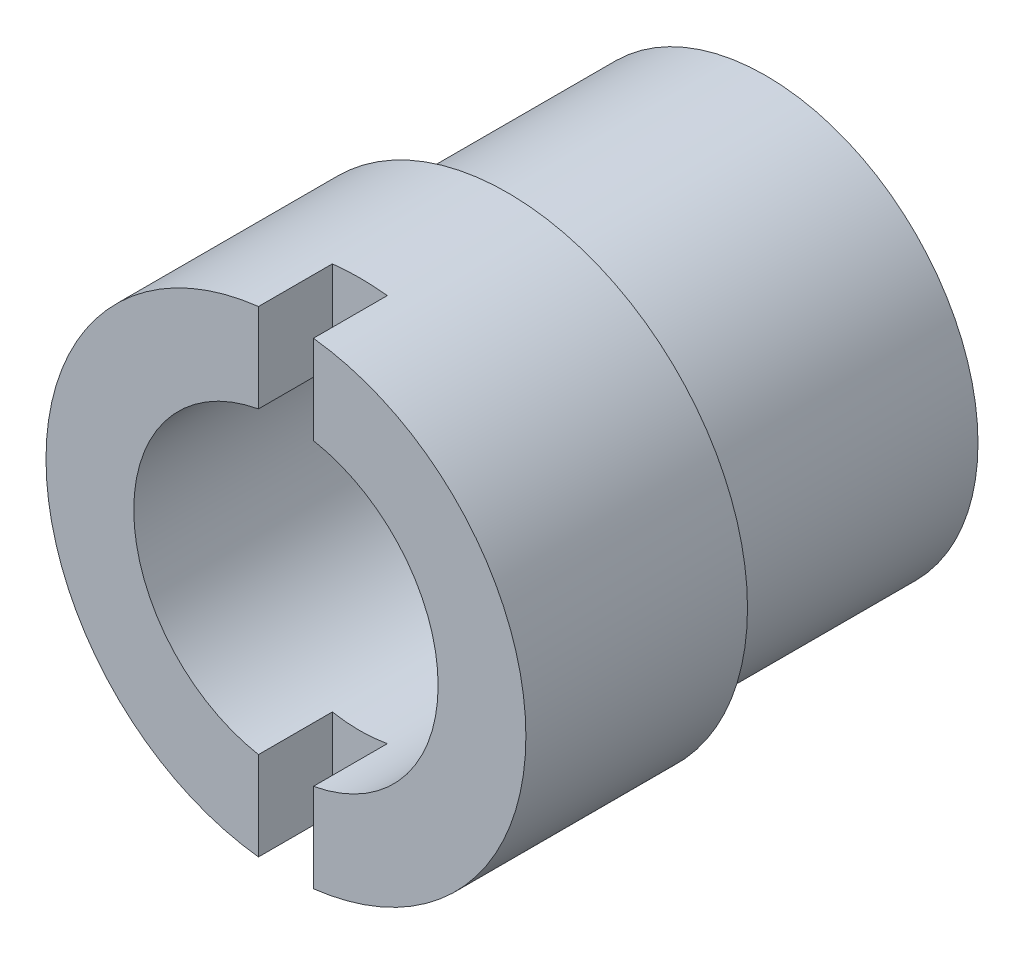
ISO-10303-21;
HEADER;
FILE_DESCRIPTION(('STEP AP214'),'2;1');
FILE_NAME('part.step','',(''),(''),'','','');
FILE_SCHEMA(('AUTOMOTIVE_DESIGN { 1 0 10303 214 1 1 1 1 }'));
ENDSEC;
DATA;
#1=APPLICATION_CONTEXT('core data for automotive mechanical design processes');
#2=APPLICATION_PROTOCOL_DEFINITION('international standard','automotive_design',2000,#1);
#3=PRODUCT_CONTEXT('',#1,'mechanical');
#4=PRODUCT('Part','Part','',(#3));
#5=PRODUCT_RELATED_PRODUCT_CATEGORY('part','',(#4));
#6=PRODUCT_DEFINITION_FORMATION('','',#4);
#7=PRODUCT_DEFINITION_CONTEXT('part definition',#1,'design');
#8=PRODUCT_DEFINITION('design','',#6,#7);
#9=PRODUCT_DEFINITION_SHAPE('','',#8);
#10=(LENGTH_UNIT() NAMED_UNIT(*) SI_UNIT(.MILLI.,.METRE.));
#11=(NAMED_UNIT(*) PLANE_ANGLE_UNIT() SI_UNIT($,.RADIAN.));
#12=(NAMED_UNIT(*) SI_UNIT($,.STERADIAN.) SOLID_ANGLE_UNIT());
#13=UNCERTAINTY_MEASURE_WITH_UNIT(LENGTH_MEASURE(1.E-05),#10,'distance_accuracy_value','');
#14=(GEOMETRIC_REPRESENTATION_CONTEXT(3) GLOBAL_UNCERTAINTY_ASSIGNED_CONTEXT((#13)) GLOBAL_UNIT_ASSIGNED_CONTEXT((#10,
#11,#12)) REPRESENTATION_CONTEXT('',''));
#15=CARTESIAN_POINT('',(0.,0.,0.));
#16=DIRECTION('',(0.,0.,1.));
#17=DIRECTION('',(1.,0.,0.));
#18=AXIS2_PLACEMENT_3D('',#15,#16,#17);
#19=CARTESIAN_POINT('',(0.,0.,0.));
#20=DIRECTION('',(0.,0.,1.));
#21=DIRECTION('',(1.,0.,0.));
#22=AXIS2_PLACEMENT_3D('',#19,#20,#21);
#23=PLANE('',#22);
#24=DIRECTION('',(0.,1.,0.));
#25=VECTOR('',#24,1.);
#26=CARTESIAN_POINT('',(-1.1811,-10.3124,0.));
#27=LINE('',#26,#25);
#28=CARTESIAN_POINT('',(-1.1811,6.43297311046766,0.));
#29=VERTEX_POINT('',#28);
#30=CARTESIAN_POINT('',(-1.1811,10.2445398408128,0.));
#31=VERTEX_POINT('',#30);
#32=EDGE_CURVE('E173',#29,#31,#27,.T.);
#33=ORIENTED_EDGE('',*,*,#32,.T.);
#34=CARTESIAN_POINT('',(0.,0.,0.));
#35=DIRECTION('',(0.,0.,1.));
#36=DIRECTION('',(1.,0.,0.));
#37=AXIS2_PLACEMENT_3D('',#34,#35,#36);
#38=CIRCLE('',#37,10.3124);
#39=CARTESIAN_POINT('',(-1.1811,-10.2445398408128,0.));
#40=VERTEX_POINT('',#39);
#41=EDGE_CURVE('E136',#31,#40,#38,.T.);
#42=ORIENTED_EDGE('',*,*,#41,.T.);
#43=CARTESIAN_POINT('',(-1.1811,-6.43297311046766,0.));
#44=VERTEX_POINT('',#43);
#45=EDGE_CURVE('E172',#40,#44,#27,.T.);
#46=ORIENTED_EDGE('',*,*,#45,.T.);
#47=CARTESIAN_POINT('',(0.,0.,0.));
#48=DIRECTION('',(0.,0.,1.));
#49=DIRECTION('',(1.,0.,0.));
#50=AXIS2_PLACEMENT_3D('',#47,#48,#49);
#51=CIRCLE('',#50,6.5405);
#52=EDGE_CURVE('E137',#29,#44,#51,.T.);
#53=ORIENTED_EDGE('',*,*,#52,.F.);
#54=EDGE_LOOP('',(#33,#42,#46,#53));
#55=FACE_BOUND('',#54,.T.);
#56=ADVANCED_FACE('F48',(#55),#23,.T.);
#57=CARTESIAN_POINT('',(0.,0.,-9.525));
#58=DIRECTION('',(0.,0.,1.));
#59=DIRECTION('',(1.,0.,0.));
#60=AXIS2_PLACEMENT_3D('',#57,#58,#59);
#61=CYLINDRICAL_SURFACE('',#60,10.3124);
#62=DIRECTION('',(0.,0.,1.));
#63=VECTOR('',#62,1.);
#64=CARTESIAN_POINT('',(-1.1811,-10.2445398408128,-9.525));
#65=LINE('',#64,#63);
#66=CARTESIAN_POINT('',(-1.1811,-10.2445398408128,-3.175));
#67=VERTEX_POINT('',#66);
#68=EDGE_CURVE('E181',#40,#67,#65,.F.);
#69=ORIENTED_EDGE('',*,*,#68,.F.);
#70=ORIENTED_EDGE('',*,*,#41,.F.);
#71=DIRECTION('',(0.,0.,1.));
#72=VECTOR('',#71,1.);
#73=CARTESIAN_POINT('',(-1.1811,10.2445398408128,-9.525));
#74=LINE('',#73,#72);
#75=CARTESIAN_POINT('',(-1.1811,10.2445398408128,-3.175));
#76=VERTEX_POINT('',#75);
#77=EDGE_CURVE('E179',#76,#31,#74,.T.);
#78=ORIENTED_EDGE('',*,*,#77,.F.);
#79=CARTESIAN_POINT('',(0.,0.,-3.175));
#80=DIRECTION('',(0.,0.,-1.));
#81=DIRECTION('',(-1.,0.,0.));
#82=AXIS2_PLACEMENT_3D('',#79,#80,#81);
#83=CIRCLE('',#82,10.3124);
#84=CARTESIAN_POINT('',(1.1811,10.2445398408128,-3.175));
#85=VERTEX_POINT('',#84);
#86=EDGE_CURVE('E165',#85,#76,#83,.F.);
#87=ORIENTED_EDGE('',*,*,#86,.F.);
#88=DIRECTION('',(0.,0.,1.));
#89=VECTOR('',#88,1.);
#90=CARTESIAN_POINT('',(1.1811,10.2445398408128,-9.525));
#91=LINE('',#90,#89);
#92=CARTESIAN_POINT('',(1.1811,10.2445398408128,0.));
#93=VERTEX_POINT('',#92);
#94=EDGE_CURVE('E119',#93,#85,#91,.F.);
#95=ORIENTED_EDGE('',*,*,#94,.F.);
#96=CARTESIAN_POINT('',(1.1811,-10.2445398408128,0.));
#97=VERTEX_POINT('',#96);
#98=EDGE_CURVE('E127',#97,#93,#38,.T.);
#99=ORIENTED_EDGE('',*,*,#98,.F.);
#100=DIRECTION('',(0.,0.,1.));
#101=VECTOR('',#100,1.);
#102=CARTESIAN_POINT('',(1.1811,-10.2445398408128,-9.525));
#103=LINE('',#102,#101);
#104=CARTESIAN_POINT('',(1.1811,-10.2445398408128,-3.175));
#105=VERTEX_POINT('',#104);
#106=EDGE_CURVE('E112',#105,#97,#103,.T.);
#107=ORIENTED_EDGE('',*,*,#106,.F.);
#108=EDGE_CURVE('E177',#67,#105,#83,.F.);
#109=ORIENTED_EDGE('',*,*,#108,.F.);
#110=EDGE_LOOP('',(#69,#70,#78,#87,#95,#99,#107,#109));
#111=FACE_BOUND('',#110,.T.);
#112=CARTESIAN_POINT('',(0.,0.,-9.525));
#113=DIRECTION('',(0.,0.,1.));
#114=DIRECTION('',(1.,0.,0.));
#115=AXIS2_PLACEMENT_3D('',#112,#113,#114);
#116=CIRCLE('',#115,10.3124);
#117=CARTESIAN_POINT('',(10.3124,0.,-9.525));
#118=VERTEX_POINT('',#117);
#119=EDGE_CURVE('E140',#118,#118,#116,.T.);
#120=ORIENTED_EDGE('',*,*,#119,.T.);
#121=EDGE_LOOP('',(#120));
#122=FACE_BOUND('',#121,.T.);
#123=ADVANCED_FACE('F50',(#111,#122),#61,.T.);
#124=CARTESIAN_POINT('',(0.,0.,-9.525));
#125=DIRECTION('',(0.,0.,1.));
#126=DIRECTION('',(1.,0.,0.));
#127=AXIS2_PLACEMENT_3D('',#124,#125,#126);
#128=PLANE('',#127);
#129=CARTESIAN_POINT('',(0.,0.,-9.525));
#130=DIRECTION('',(0.,0.,-1.));
#131=DIRECTION('',(-1.,0.,0.));
#132=AXIS2_PLACEMENT_3D('',#129,#130,#131);
#133=CIRCLE('',#132,9.1186);
#134=CARTESIAN_POINT('',(-9.1186,0.,-9.525));
#135=VERTEX_POINT('',#134);
#136=EDGE_CURVE('E148',#135,#135,#133,.T.);
#137=ORIENTED_EDGE('',*,*,#136,.F.);
#138=EDGE_LOOP('',(#137));
#139=FACE_BOUND('',#138,.T.);
#140=ORIENTED_EDGE('',*,*,#119,.F.);
#141=EDGE_LOOP('',(#140));
#142=FACE_BOUND('',#141,.T.);
#143=ADVANCED_FACE('F215',(#139,#142),#128,.F.);
#144=DIRECTION('',(0.,1.,0.));
#145=VECTOR('',#144,1.);
#146=CARTESIAN_POINT('',(1.1811,-10.3124,0.));
#147=LINE('',#146,#145);
#148=CARTESIAN_POINT('',(1.1811,-6.43297311046766,0.));
#149=VERTEX_POINT('',#148);
#150=EDGE_CURVE('E71',#97,#149,#147,.T.);
#151=ORIENTED_EDGE('',*,*,#150,.F.);
#152=ORIENTED_EDGE('',*,*,#98,.T.);
#153=CARTESIAN_POINT('',(1.1811,6.43297311046766,0.));
#154=VERTEX_POINT('',#153);
#155=EDGE_CURVE('E130',#154,#93,#147,.T.);
#156=ORIENTED_EDGE('',*,*,#155,.F.);
#157=EDGE_CURVE('E129',#149,#154,#51,.T.);
#158=ORIENTED_EDGE('',*,*,#157,.F.);
#159=EDGE_LOOP('',(#151,#152,#156,#158));
#160=FACE_BOUND('',#159,.T.);
#161=ADVANCED_FACE('F125',(#160),#23,.T.);
#162=CARTESIAN_POINT('',(0.,0.,-9.525));
#163=DIRECTION('',(0.,0.,1.));
#164=DIRECTION('',(1.,0.,0.));
#165=AXIS2_PLACEMENT_3D('',#162,#163,#164);
#166=CYLINDRICAL_SURFACE('',#165,6.5405);
#167=CARTESIAN_POINT('',(0.,0.,-3.175));
#168=DIRECTION('',(0.,0.,-1.));
#169=DIRECTION('',(-1.,0.,0.));
#170=AXIS2_PLACEMENT_3D('',#167,#168,#169);
#171=CIRCLE('',#170,6.5405);
#172=CARTESIAN_POINT('',(1.1811,6.43297311046766,-3.175));
#173=VERTEX_POINT('',#172);
#174=CARTESIAN_POINT('',(-1.1811,6.43297311046766,-3.175));
#175=VERTEX_POINT('',#174);
#176=EDGE_CURVE('E56',#173,#175,#171,.F.);
#177=ORIENTED_EDGE('',*,*,#176,.T.);
#178=DIRECTION('',(0.,0.,1.));
#179=VECTOR('',#178,1.);
#180=CARTESIAN_POINT('',(-1.1811,6.43297311046766,-9.525));
#181=LINE('',#180,#179);
#182=EDGE_CURVE('E12',#175,#29,#181,.T.);
#183=ORIENTED_EDGE('',*,*,#182,.T.);
#184=ORIENTED_EDGE('',*,*,#52,.T.);
#185=DIRECTION('',(0.,0.,1.));
#186=VECTOR('',#185,1.);
#187=CARTESIAN_POINT('',(-1.1811,-6.43297311046766,-9.525));
#188=LINE('',#187,#186);
#189=CARTESIAN_POINT('',(-1.1811,-6.43297311046766,-3.175));
#190=VERTEX_POINT('',#189);
#191=EDGE_CURVE('E151',#44,#190,#188,.F.);
#192=ORIENTED_EDGE('',*,*,#191,.T.);
#193=CARTESIAN_POINT('',(1.1811,-6.43297311046766,-3.175));
#194=VERTEX_POINT('',#193);
#195=EDGE_CURVE('E147',#190,#194,#171,.F.);
#196=ORIENTED_EDGE('',*,*,#195,.T.);
#197=DIRECTION('',(0.,0.,1.));
#198=VECTOR('',#197,1.);
#199=CARTESIAN_POINT('',(1.1811,-6.43297311046766,-9.525));
#200=LINE('',#199,#198);
#201=EDGE_CURVE('E145',#194,#149,#200,.T.);
#202=ORIENTED_EDGE('',*,*,#201,.T.);
#203=ORIENTED_EDGE('',*,*,#157,.T.);
#204=DIRECTION('',(0.,0.,1.));
#205=VECTOR('',#204,1.);
#206=CARTESIAN_POINT('',(1.1811,6.43297311046766,-9.525));
#207=LINE('',#206,#205);
#208=EDGE_CURVE('E153',#154,#173,#207,.F.);
#209=ORIENTED_EDGE('',*,*,#208,.T.);
#210=EDGE_LOOP('',(#177,#183,#184,#192,#196,#202,#203,#209));
#211=FACE_BOUND('',#210,.T.);
#212=CARTESIAN_POINT('',(0.,0.,-20.6248));
#213=DIRECTION('',(0.,0.,-1.));
#214=DIRECTION('',(-1.,0.,0.));
#215=AXIS2_PLACEMENT_3D('',#212,#213,#214);
#216=CIRCLE('',#215,6.5405);
#217=CARTESIAN_POINT('',(-6.5405,0.,-20.6248));
#218=VERTEX_POINT('',#217);
#219=EDGE_CURVE('E183',#218,#218,#216,.T.);
#220=ORIENTED_EDGE('',*,*,#219,.T.);
#221=EDGE_LOOP('',(#220));
#222=FACE_BOUND('',#221,.T.);
#223=ADVANCED_FACE('F157',(#211,#222),#166,.F.);
#224=CARTESIAN_POINT('',(0.,0.,-20.6248));
#225=DIRECTION('',(0.,0.,-1.));
#226=DIRECTION('',(-1.,0.,0.));
#227=AXIS2_PLACEMENT_3D('',#224,#225,#226);
#228=PLANE('',#227);
#229=CARTESIAN_POINT('',(0.,0.,-20.6248));
#230=DIRECTION('',(0.,0.,-1.));
#231=DIRECTION('',(-1.,0.,0.));
#232=AXIS2_PLACEMENT_3D('',#229,#230,#231);
#233=CIRCLE('',#232,9.1186);
#234=CARTESIAN_POINT('',(-9.1186,0.,-20.6248));
#235=VERTEX_POINT('',#234);
#236=EDGE_CURVE('E186',#235,#235,#233,.T.);
#237=ORIENTED_EDGE('',*,*,#236,.T.);
#238=EDGE_LOOP('',(#237));
#239=FACE_BOUND('',#238,.T.);
#240=ORIENTED_EDGE('',*,*,#219,.F.);
#241=EDGE_LOOP('',(#240));
#242=FACE_BOUND('',#241,.T.);
#243=ADVANCED_FACE('F221',(#239,#242),#228,.T.);
#244=CARTESIAN_POINT('',(0.,0.,-20.6248));
#245=DIRECTION('',(0.,0.,1.));
#246=DIRECTION('',(1.,0.,0.));
#247=AXIS2_PLACEMENT_3D('',#244,#245,#246);
#248=CYLINDRICAL_SURFACE('',#247,9.1186);
#249=ORIENTED_EDGE('',*,*,#236,.F.);
#250=EDGE_LOOP('',(#249));
#251=FACE_BOUND('',#250,.T.);
#252=ORIENTED_EDGE('',*,*,#136,.T.);
#253=EDGE_LOOP('',(#252));
#254=FACE_BOUND('',#253,.T.);
#255=ADVANCED_FACE('F231',(#251,#254),#248,.T.);
#256=CARTESIAN_POINT('',(1.1811,-10.3124,0.));
#257=DIRECTION('',(1.,0.,0.));
#258=DIRECTION('',(0.,0.,-1.));
#259=AXIS2_PLACEMENT_3D('',#256,#257,#258);
#260=PLANE('',#259);
#261=ORIENTED_EDGE('',*,*,#106,.T.);
#262=ORIENTED_EDGE('',*,*,#150,.T.);
#263=ORIENTED_EDGE('',*,*,#201,.F.);
#264=DIRECTION('',(0.,1.,0.));
#265=VECTOR('',#264,1.);
#266=CARTESIAN_POINT('',(1.1811,-10.3124,-3.175));
#267=LINE('',#266,#265);
#268=EDGE_CURVE('E115',#105,#194,#267,.T.);
#269=ORIENTED_EDGE('',*,*,#268,.F.);
#270=EDGE_LOOP('',(#261,#262,#263,#269));
#271=FACE_BOUND('',#270,.T.);
#272=ADVANCED_FACE('F113',(#271),#260,.F.);
#273=CARTESIAN_POINT('',(-1.1811,-10.3124,-3.175));
#274=DIRECTION('',(0.,0.,-1.));
#275=DIRECTION('',(-1.,0.,0.));
#276=AXIS2_PLACEMENT_3D('',#273,#274,#275);
#277=PLANE('',#276);
#278=ORIENTED_EDGE('',*,*,#108,.T.);
#279=ORIENTED_EDGE('',*,*,#268,.T.);
#280=ORIENTED_EDGE('',*,*,#195,.F.);
#281=DIRECTION('',(0.,1.,0.));
#282=VECTOR('',#281,1.);
#283=CARTESIAN_POINT('',(-1.1811,-10.3124,-3.175));
#284=LINE('',#283,#282);
#285=EDGE_CURVE('E120',#67,#190,#284,.T.);
#286=ORIENTED_EDGE('',*,*,#285,.F.);
#287=EDGE_LOOP('',(#278,#279,#280,#286));
#288=FACE_BOUND('',#287,.T.);
#289=ADVANCED_FACE('F191',(#288),#277,.F.);
#290=CARTESIAN_POINT('',(-1.1811,-10.3124,0.));
#291=DIRECTION('',(-1.,0.,0.));
#292=DIRECTION('',(0.,0.,1.));
#293=AXIS2_PLACEMENT_3D('',#290,#291,#292);
#294=PLANE('',#293);
#295=ORIENTED_EDGE('',*,*,#68,.T.);
#296=ORIENTED_EDGE('',*,*,#285,.T.);
#297=ORIENTED_EDGE('',*,*,#191,.F.);
#298=ORIENTED_EDGE('',*,*,#45,.F.);
#299=EDGE_LOOP('',(#295,#296,#297,#298));
#300=FACE_BOUND('',#299,.T.);
#301=ADVANCED_FACE('F199',(#300),#294,.F.);
#302=ORIENTED_EDGE('',*,*,#77,.T.);
#303=ORIENTED_EDGE('',*,*,#32,.F.);
#304=ORIENTED_EDGE('',*,*,#182,.F.);
#305=EDGE_CURVE('E164',#175,#76,#284,.T.);
#306=ORIENTED_EDGE('',*,*,#305,.T.);
#307=EDGE_LOOP('',(#302,#303,#304,#306));
#308=FACE_BOUND('',#307,.T.);
#309=ADVANCED_FACE('F197',(#308),#294,.F.);
#310=ORIENTED_EDGE('',*,*,#86,.T.);
#311=ORIENTED_EDGE('',*,*,#305,.F.);
#312=ORIENTED_EDGE('',*,*,#176,.F.);
#313=EDGE_CURVE('E63',#173,#85,#267,.T.);
#314=ORIENTED_EDGE('',*,*,#313,.T.);
#315=EDGE_LOOP('',(#310,#311,#312,#314));
#316=FACE_BOUND('',#315,.T.);
#317=ADVANCED_FACE('F162',(#316),#277,.F.);
#318=ORIENTED_EDGE('',*,*,#94,.T.);
#319=ORIENTED_EDGE('',*,*,#313,.F.);
#320=ORIENTED_EDGE('',*,*,#208,.F.);
#321=ORIENTED_EDGE('',*,*,#155,.T.);
#322=EDGE_LOOP('',(#318,#319,#320,#321));
#323=FACE_BOUND('',#322,.T.);
#324=ADVANCED_FACE('F205',(#323),#260,.F.);
#325=CLOSED_SHELL('',(#56,#123,#143,#161,#223,#243,#255,#272,#289,#301,#309,#317,#324));
#326=MANIFOLD_SOLID_BREP('B2',#325);
#327=ADVANCED_BREP_SHAPE_REPRESENTATION('',(#18,#326),#14);
#328=SHAPE_DEFINITION_REPRESENTATION(#9,#327);
ENDSEC;
END-ISO-10303-21;
